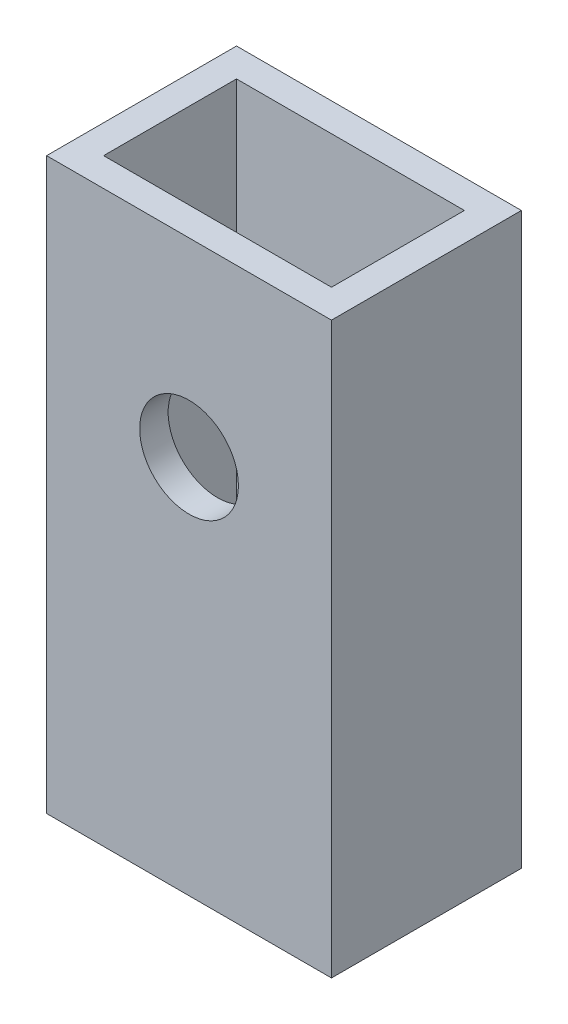
ISO-10303-21;
HEADER;
FILE_DESCRIPTION(('STEP AP214'),'2;1');
FILE_NAME('part.step','',(''),(''),'','','');
FILE_SCHEMA(('AUTOMOTIVE_DESIGN { 1 0 10303 214 1 1 1 1 }'));
ENDSEC;
DATA;
#1=APPLICATION_CONTEXT('core data for automotive mechanical design processes');
#2=APPLICATION_PROTOCOL_DEFINITION('international standard','automotive_design',2000,#1);
#3=PRODUCT_CONTEXT('',#1,'mechanical');
#4=PRODUCT('Part','Part','',(#3));
#5=PRODUCT_RELATED_PRODUCT_CATEGORY('part','',(#4));
#6=PRODUCT_DEFINITION_FORMATION('','',#4);
#7=PRODUCT_DEFINITION_CONTEXT('part definition',#1,'design');
#8=PRODUCT_DEFINITION('design','',#6,#7);
#9=PRODUCT_DEFINITION_SHAPE('','',#8);
#10=(LENGTH_UNIT() NAMED_UNIT(*) SI_UNIT(.MILLI.,.METRE.));
#11=(NAMED_UNIT(*) PLANE_ANGLE_UNIT() SI_UNIT($,.RADIAN.));
#12=(NAMED_UNIT(*) SI_UNIT($,.STERADIAN.) SOLID_ANGLE_UNIT());
#13=UNCERTAINTY_MEASURE_WITH_UNIT(LENGTH_MEASURE(1.E-05),#10,'distance_accuracy_value','');
#14=(GEOMETRIC_REPRESENTATION_CONTEXT(3) GLOBAL_UNCERTAINTY_ASSIGNED_CONTEXT((#13)) GLOBAL_UNIT_ASSIGNED_CONTEXT((#10,
#11,#12)) REPRESENTATION_CONTEXT('',''));
#15=CARTESIAN_POINT('',(0.,0.,0.));
#16=DIRECTION('',(0.,0.,1.));
#17=DIRECTION('',(1.,0.,0.));
#18=AXIS2_PLACEMENT_3D('',#15,#16,#17);
#19=CARTESIAN_POINT('',(7.5,30.,-5.));
#20=DIRECTION('',(-1.,0.,0.));
#21=DIRECTION('',(0.,0.,1.));
#22=AXIS2_PLACEMENT_3D('',#19,#20,#21);
#23=PLANE('',#22);
#24=DIRECTION('',(0.,0.,-1.));
#25=VECTOR('',#24,1.);
#26=CARTESIAN_POINT('',(7.5,0.,-5.));
#27=LINE('',#26,#25);
#28=CARTESIAN_POINT('',(7.5,0.,5.));
#29=VERTEX_POINT('',#28);
#30=CARTESIAN_POINT('',(7.5,0.,-5.));
#31=VERTEX_POINT('',#30);
#32=EDGE_CURVE('E144',#29,#31,#27,.T.);
#33=ORIENTED_EDGE('',*,*,#32,.T.);
#34=DIRECTION('',(0.,-1.,0.));
#35=VECTOR('',#34,1.);
#36=CARTESIAN_POINT('',(7.5,30.,-5.));
#37=LINE('',#36,#35);
#38=CARTESIAN_POINT('',(7.5,30.,-5.));
#39=VERTEX_POINT('',#38);
#40=EDGE_CURVE('E12',#39,#31,#37,.T.);
#41=ORIENTED_EDGE('',*,*,#40,.F.);
#42=DIRECTION('',(0.,0.,-1.));
#43=VECTOR('',#42,1.);
#44=CARTESIAN_POINT('',(7.5,30.,-5.));
#45=LINE('',#44,#43);
#46=CARTESIAN_POINT('',(7.5,30.,5.));
#47=VERTEX_POINT('',#46);
#48=EDGE_CURVE('E146',#47,#39,#45,.T.);
#49=ORIENTED_EDGE('',*,*,#48,.F.);
#50=DIRECTION('',(0.,-1.,0.));
#51=VECTOR('',#50,1.);
#52=CARTESIAN_POINT('',(7.5,30.,5.));
#53=LINE('',#52,#51);
#54=EDGE_CURVE('E152',#47,#29,#53,.T.);
#55=ORIENTED_EDGE('',*,*,#54,.T.);
#56=EDGE_LOOP('',(#33,#41,#49,#55));
#57=FACE_BOUND('',#56,.T.);
#58=ADVANCED_FACE('F37',(#57),#23,.F.);
#59=CARTESIAN_POINT('',(-7.5,30.,-5.));
#60=DIRECTION('',(0.,0.,1.));
#61=DIRECTION('',(1.,0.,0.));
#62=AXIS2_PLACEMENT_3D('',#59,#60,#61);
#63=PLANE('',#62);
#64=CARTESIAN_POINT('',(0.,6.25,-5.));
#65=DIRECTION('',(0.,0.,-1.));
#66=DIRECTION('',(-1.,0.,0.));
#67=AXIS2_PLACEMENT_3D('',#64,#65,#66);
#68=CIRCLE('',#67,1.6);
#69=CARTESIAN_POINT('',(-1.6,6.25,-5.));
#70=VERTEX_POINT('',#69);
#71=EDGE_CURVE('E198',#70,#70,#68,.T.);
#72=ORIENTED_EDGE('',*,*,#71,.F.);
#73=EDGE_LOOP('',(#72));
#74=FACE_BOUND('',#73,.T.);
#75=CARTESIAN_POINT('',(0.,20.,-5.));
#76=DIRECTION('',(0.,0.,1.));
#77=DIRECTION('',(1.,0.,0.));
#78=AXIS2_PLACEMENT_3D('',#75,#76,#77);
#79=CIRCLE('',#78,2.6);
#80=CARTESIAN_POINT('',(2.6,20.,-5.));
#81=VERTEX_POINT('',#80);
#82=EDGE_CURVE('E201',#81,#81,#79,.T.);
#83=ORIENTED_EDGE('',*,*,#82,.T.);
#84=EDGE_LOOP('',(#83));
#85=FACE_BOUND('',#84,.T.);
#86=DIRECTION('',(-1.,0.,0.));
#87=VECTOR('',#86,1.);
#88=CARTESIAN_POINT('',(-7.5,0.,-5.));
#89=LINE('',#88,#87);
#90=CARTESIAN_POINT('',(-7.5,0.,-5.));
#91=VERTEX_POINT('',#90);
#92=EDGE_CURVE('E155',#31,#91,#89,.T.);
#93=ORIENTED_EDGE('',*,*,#92,.T.);
#94=DIRECTION('',(0.,-1.,0.));
#95=VECTOR('',#94,1.);
#96=CARTESIAN_POINT('',(-7.5,30.,-5.));
#97=LINE('',#96,#95);
#98=CARTESIAN_POINT('',(-7.5,30.,-5.));
#99=VERTEX_POINT('',#98);
#100=EDGE_CURVE('E45',#99,#91,#97,.T.);
#101=ORIENTED_EDGE('',*,*,#100,.F.);
#102=DIRECTION('',(-1.,0.,0.));
#103=VECTOR('',#102,1.);
#104=CARTESIAN_POINT('',(-7.5,30.,-5.));
#105=LINE('',#104,#103);
#106=EDGE_CURVE('E89',#39,#99,#105,.T.);
#107=ORIENTED_EDGE('',*,*,#106,.F.);
#108=ORIENTED_EDGE('',*,*,#40,.T.);
#109=EDGE_LOOP('',(#93,#101,#107,#108));
#110=FACE_BOUND('',#109,.T.);
#111=ADVANCED_FACE('F184',(#74,#85,#110),#63,.F.);
#112=CARTESIAN_POINT('',(-7.5,30.,-5.));
#113=DIRECTION('',(1.,0.,0.));
#114=DIRECTION('',(0.,0.,-1.));
#115=AXIS2_PLACEMENT_3D('',#112,#113,#114);
#116=PLANE('',#115);
#117=DIRECTION('',(0.,0.,1.));
#118=VECTOR('',#117,1.);
#119=CARTESIAN_POINT('',(-7.5,0.,-5.));
#120=LINE('',#119,#118);
#121=CARTESIAN_POINT('',(-7.5,0.,5.));
#122=VERTEX_POINT('',#121);
#123=EDGE_CURVE('E157',#91,#122,#120,.T.);
#124=ORIENTED_EDGE('',*,*,#123,.T.);
#125=DIRECTION('',(0.,-1.,0.));
#126=VECTOR('',#125,1.);
#127=CARTESIAN_POINT('',(-7.5,30.,5.));
#128=LINE('',#127,#126);
#129=CARTESIAN_POINT('',(-7.5,30.,5.));
#130=VERTEX_POINT('',#129);
#131=EDGE_CURVE('E161',#130,#122,#128,.T.);
#132=ORIENTED_EDGE('',*,*,#131,.F.);
#133=DIRECTION('',(0.,0.,1.));
#134=VECTOR('',#133,1.);
#135=CARTESIAN_POINT('',(-7.5,30.,-5.));
#136=LINE('',#135,#134);
#137=EDGE_CURVE('E149',#99,#130,#136,.T.);
#138=ORIENTED_EDGE('',*,*,#137,.F.);
#139=ORIENTED_EDGE('',*,*,#100,.T.);
#140=EDGE_LOOP('',(#124,#132,#138,#139));
#141=FACE_BOUND('',#140,.T.);
#142=ADVANCED_FACE('F167',(#141),#116,.F.);
#143=CARTESIAN_POINT('',(-7.5,30.,5.));
#144=DIRECTION('',(0.,0.,-1.));
#145=DIRECTION('',(-1.,0.,0.));
#146=AXIS2_PLACEMENT_3D('',#143,#144,#145);
#147=PLANE('',#146);
#148=CARTESIAN_POINT('',(0.,20.,5.));
#149=DIRECTION('',(0.,0.,1.));
#150=DIRECTION('',(1.,0.,0.));
#151=AXIS2_PLACEMENT_3D('',#148,#149,#150);
#152=CIRCLE('',#151,2.6);
#153=CARTESIAN_POINT('',(2.6,20.,5.));
#154=VERTEX_POINT('',#153);
#155=EDGE_CURVE('E203',#154,#154,#152,.T.);
#156=ORIENTED_EDGE('',*,*,#155,.F.);
#157=EDGE_LOOP('',(#156));
#158=FACE_BOUND('',#157,.T.);
#159=DIRECTION('',(1.,0.,0.));
#160=VECTOR('',#159,1.);
#161=CARTESIAN_POINT('',(-7.5,0.,5.));
#162=LINE('',#161,#160);
#163=EDGE_CURVE('E82',#122,#29,#162,.T.);
#164=ORIENTED_EDGE('',*,*,#163,.T.);
#165=ORIENTED_EDGE('',*,*,#54,.F.);
#166=DIRECTION('',(1.,0.,0.));
#167=VECTOR('',#166,1.);
#168=CARTESIAN_POINT('',(-7.5,30.,5.));
#169=LINE('',#168,#167);
#170=EDGE_CURVE('E61',#130,#47,#169,.T.);
#171=ORIENTED_EDGE('',*,*,#170,.F.);
#172=ORIENTED_EDGE('',*,*,#131,.T.);
#173=EDGE_LOOP('',(#164,#165,#171,#172));
#174=FACE_BOUND('',#173,.T.);
#175=ADVANCED_FACE('F175',(#158,#174),#147,.F.);
#176=CARTESIAN_POINT('',(0.,30.,0.));
#177=DIRECTION('',(0.,1.,0.));
#178=DIRECTION('',(0.,0.,1.));
#179=AXIS2_PLACEMENT_3D('',#176,#177,#178);
#180=PLANE('',#179);
#181=DIRECTION('',(0.,0.,-1.));
#182=VECTOR('',#181,1.);
#183=CARTESIAN_POINT('',(6.,30.,-3.5));
#184=LINE('',#183,#182);
#185=CARTESIAN_POINT('',(6.,30.,3.5));
#186=VERTEX_POINT('',#185);
#187=CARTESIAN_POINT('',(6.,30.,-3.5));
#188=VERTEX_POINT('',#187);
#189=EDGE_CURVE('E52',#186,#188,#184,.T.);
#190=ORIENTED_EDGE('',*,*,#189,.F.);
#191=DIRECTION('',(1.,0.,0.));
#192=VECTOR('',#191,1.);
#193=CARTESIAN_POINT('',(-6.,30.,3.50000000000001));
#194=LINE('',#193,#192);
#195=CARTESIAN_POINT('',(-6.,30.,3.50000000000001));
#196=VERTEX_POINT('',#195);
#197=EDGE_CURVE('E133',#196,#186,#194,.T.);
#198=ORIENTED_EDGE('',*,*,#197,.F.);
#199=DIRECTION('',(0.,0.,1.));
#200=VECTOR('',#199,1.);
#201=CARTESIAN_POINT('',(-6.,30.,-3.5));
#202=LINE('',#201,#200);
#203=CARTESIAN_POINT('',(-6.,30.,-3.5));
#204=VERTEX_POINT('',#203);
#205=EDGE_CURVE('E117',#204,#196,#202,.T.);
#206=ORIENTED_EDGE('',*,*,#205,.F.);
#207=DIRECTION('',(-1.,0.,0.));
#208=VECTOR('',#207,1.);
#209=CARTESIAN_POINT('',(-6.,30.,-3.5));
#210=LINE('',#209,#208);
#211=EDGE_CURVE('E127',#188,#204,#210,.T.);
#212=ORIENTED_EDGE('',*,*,#211,.F.);
#213=EDGE_LOOP('',(#190,#198,#206,#212));
#214=FACE_BOUND('',#213,.T.);
#215=ORIENTED_EDGE('',*,*,#48,.T.);
#216=ORIENTED_EDGE('',*,*,#106,.T.);
#217=ORIENTED_EDGE('',*,*,#137,.T.);
#218=ORIENTED_EDGE('',*,*,#170,.T.);
#219=EDGE_LOOP('',(#215,#216,#217,#218));
#220=FACE_BOUND('',#219,.T.);
#221=ADVANCED_FACE('F131',(#214,#220),#180,.T.);
#222=CARTESIAN_POINT('',(0.,0.,0.));
#223=DIRECTION('',(0.,1.,0.));
#224=DIRECTION('',(0.,0.,1.));
#225=AXIS2_PLACEMENT_3D('',#222,#223,#224);
#226=PLANE('',#225);
#227=ORIENTED_EDGE('',*,*,#32,.F.);
#228=ORIENTED_EDGE('',*,*,#163,.F.);
#229=ORIENTED_EDGE('',*,*,#123,.F.);
#230=ORIENTED_EDGE('',*,*,#92,.F.);
#231=EDGE_LOOP('',(#227,#228,#229,#230));
#232=FACE_BOUND('',#231,.T.);
#233=ADVANCED_FACE('F171',(#232),#226,.F.);
#234=CARTESIAN_POINT('',(6.,-13.8924439894498,-3.5));
#235=DIRECTION('',(1.,0.,0.));
#236=DIRECTION('',(0.,0.,-1.));
#237=AXIS2_PLACEMENT_3D('',#234,#235,#236);
#238=PLANE('',#237);
#239=DIRECTION('',(0.,0.,1.));
#240=VECTOR('',#239,1.);
#241=CARTESIAN_POINT('',(6.,1.5,-3.5));
#242=LINE('',#241,#240);
#243=CARTESIAN_POINT('',(6.,1.5,-3.5));
#244=VERTEX_POINT('',#243);
#245=CARTESIAN_POINT('',(6.,1.5,3.5));
#246=VERTEX_POINT('',#245);
#247=EDGE_CURVE('E145',#244,#246,#242,.T.);
#248=ORIENTED_EDGE('',*,*,#247,.T.);
#249=DIRECTION('',(0.,1.,0.));
#250=VECTOR('',#249,1.);
#251=CARTESIAN_POINT('',(6.,-13.8924439894498,3.5));
#252=LINE('',#251,#250);
#253=EDGE_CURVE('E138',#246,#186,#252,.T.);
#254=ORIENTED_EDGE('',*,*,#253,.T.);
#255=ORIENTED_EDGE('',*,*,#189,.T.);
#256=DIRECTION('',(0.,1.,0.));
#257=VECTOR('',#256,1.);
#258=CARTESIAN_POINT('',(6.,-13.8924439894498,-3.5));
#259=LINE('',#258,#257);
#260=EDGE_CURVE('E124',#244,#188,#259,.T.);
#261=ORIENTED_EDGE('',*,*,#260,.F.);
#262=EDGE_LOOP('',(#248,#254,#255,#261));
#263=FACE_BOUND('',#262,.T.);
#264=ADVANCED_FACE('F220',(#263),#238,.F.);
#265=CARTESIAN_POINT('',(-6.,-13.8924439894498,3.50000000000001));
#266=DIRECTION('',(0.,0.,1.));
#267=DIRECTION('',(1.,0.,0.));
#268=AXIS2_PLACEMENT_3D('',#265,#266,#267);
#269=PLANE('',#268);
#270=CARTESIAN_POINT('',(0.,20.,3.5));
#271=DIRECTION('',(0.,0.,1.));
#272=DIRECTION('',(1.,0.,0.));
#273=AXIS2_PLACEMENT_3D('',#270,#271,#272);
#274=CIRCLE('',#273,2.6);
#275=CARTESIAN_POINT('',(2.6,20.,3.5));
#276=VERTEX_POINT('',#275);
#277=EDGE_CURVE('E206',#276,#276,#274,.T.);
#278=ORIENTED_EDGE('',*,*,#277,.T.);
#279=EDGE_LOOP('',(#278));
#280=FACE_BOUND('',#279,.T.);
#281=DIRECTION('',(-1.,0.,0.));
#282=VECTOR('',#281,1.);
#283=CARTESIAN_POINT('',(-6.,1.5,3.50000000000001));
#284=LINE('',#283,#282);
#285=CARTESIAN_POINT('',(-6.,1.5,3.50000000000001));
#286=VERTEX_POINT('',#285);
#287=EDGE_CURVE('E216',#246,#286,#284,.T.);
#288=ORIENTED_EDGE('',*,*,#287,.T.);
#289=DIRECTION('',(0.,1.,0.));
#290=VECTOR('',#289,1.);
#291=CARTESIAN_POINT('',(-6.,-13.8924439894498,3.50000000000001));
#292=LINE('',#291,#290);
#293=EDGE_CURVE('E123',#286,#196,#292,.T.);
#294=ORIENTED_EDGE('',*,*,#293,.T.);
#295=ORIENTED_EDGE('',*,*,#197,.T.);
#296=ORIENTED_EDGE('',*,*,#253,.F.);
#297=EDGE_LOOP('',(#288,#294,#295,#296));
#298=FACE_BOUND('',#297,.T.);
#299=ADVANCED_FACE('F225',(#280,#298),#269,.F.);
#300=CARTESIAN_POINT('',(-6.,-13.8924439894498,-3.5));
#301=DIRECTION('',(-1.,0.,0.));
#302=DIRECTION('',(0.,0.,1.));
#303=AXIS2_PLACEMENT_3D('',#300,#301,#302);
#304=PLANE('',#303);
#305=DIRECTION('',(0.,0.,-1.));
#306=VECTOR('',#305,1.);
#307=CARTESIAN_POINT('',(-6.,1.5,-3.5));
#308=LINE('',#307,#306);
#309=CARTESIAN_POINT('',(-6.,1.5,-3.5));
#310=VERTEX_POINT('',#309);
#311=EDGE_CURVE('E120',#286,#310,#308,.T.);
#312=ORIENTED_EDGE('',*,*,#311,.T.);
#313=DIRECTION('',(0.,1.,0.));
#314=VECTOR('',#313,1.);
#315=CARTESIAN_POINT('',(-6.,-13.8924439894498,-3.5));
#316=LINE('',#315,#314);
#317=EDGE_CURVE('E112',#310,#204,#316,.T.);
#318=ORIENTED_EDGE('',*,*,#317,.T.);
#319=ORIENTED_EDGE('',*,*,#205,.T.);
#320=ORIENTED_EDGE('',*,*,#293,.F.);
#321=EDGE_LOOP('',(#312,#318,#319,#320));
#322=FACE_BOUND('',#321,.T.);
#323=ADVANCED_FACE('F114',(#322),#304,.F.);
#324=CARTESIAN_POINT('',(-6.,-13.8924439894498,-3.5));
#325=DIRECTION('',(0.,0.,-1.));
#326=DIRECTION('',(-1.,0.,0.));
#327=AXIS2_PLACEMENT_3D('',#324,#325,#326);
#328=PLANE('',#327);
#329=CARTESIAN_POINT('',(0.,6.25,-3.5));
#330=DIRECTION('',(0.,0.,-1.));
#331=DIRECTION('',(-1.,0.,0.));
#332=AXIS2_PLACEMENT_3D('',#329,#330,#331);
#333=CIRCLE('',#332,1.6);
#334=CARTESIAN_POINT('',(-1.6,6.25,-3.5));
#335=VERTEX_POINT('',#334);
#336=EDGE_CURVE('E208',#335,#335,#333,.T.);
#337=ORIENTED_EDGE('',*,*,#336,.T.);
#338=EDGE_LOOP('',(#337));
#339=FACE_BOUND('',#338,.T.);
#340=CARTESIAN_POINT('',(0.,20.,-3.5));
#341=DIRECTION('',(0.,0.,-1.));
#342=DIRECTION('',(-1.,0.,0.));
#343=AXIS2_PLACEMENT_3D('',#340,#341,#342);
#344=CIRCLE('',#343,2.6);
#345=CARTESIAN_POINT('',(-2.6,20.,-3.5));
#346=VERTEX_POINT('',#345);
#347=EDGE_CURVE('E40',#346,#346,#344,.T.);
#348=ORIENTED_EDGE('',*,*,#347,.T.);
#349=EDGE_LOOP('',(#348));
#350=FACE_BOUND('',#349,.T.);
#351=DIRECTION('',(1.,0.,0.));
#352=VECTOR('',#351,1.);
#353=CARTESIAN_POINT('',(-6.,1.5,-3.5));
#354=LINE('',#353,#352);
#355=EDGE_CURVE('E142',#310,#244,#354,.T.);
#356=ORIENTED_EDGE('',*,*,#355,.T.);
#357=ORIENTED_EDGE('',*,*,#260,.T.);
#358=ORIENTED_EDGE('',*,*,#211,.T.);
#359=ORIENTED_EDGE('',*,*,#317,.F.);
#360=EDGE_LOOP('',(#356,#357,#358,#359));
#361=FACE_BOUND('',#360,.T.);
#362=ADVANCED_FACE('F128',(#339,#350,#361),#328,.F.);
#363=CARTESIAN_POINT('',(0.,1.5,0.));
#364=DIRECTION('',(0.,1.,0.));
#365=DIRECTION('',(0.,0.,1.));
#366=AXIS2_PLACEMENT_3D('',#363,#364,#365);
#367=PLANE('',#366);
#368=ORIENTED_EDGE('',*,*,#247,.F.);
#369=ORIENTED_EDGE('',*,*,#355,.F.);
#370=ORIENTED_EDGE('',*,*,#311,.F.);
#371=ORIENTED_EDGE('',*,*,#287,.F.);
#372=EDGE_LOOP('',(#368,#369,#370,#371));
#373=FACE_BOUND('',#372,.T.);
#374=ADVANCED_FACE('F223',(#373),#367,.T.);
#375=CARTESIAN_POINT('',(0.,20.,-5.));
#376=DIRECTION('',(0.,0.,1.));
#377=DIRECTION('',(1.,0.,0.));
#378=AXIS2_PLACEMENT_3D('',#375,#376,#377);
#379=CYLINDRICAL_SURFACE('',#378,2.6);
#380=ORIENTED_EDGE('',*,*,#82,.F.);
#381=EDGE_LOOP('',(#380));
#382=FACE_BOUND('',#381,.T.);
#383=ORIENTED_EDGE('',*,*,#347,.F.);
#384=EDGE_LOOP('',(#383));
#385=FACE_BOUND('',#384,.T.);
#386=ADVANCED_FACE('F268',(#382,#385),#379,.F.);
#387=ORIENTED_EDGE('',*,*,#155,.T.);
#388=EDGE_LOOP('',(#387));
#389=FACE_BOUND('',#388,.T.);
#390=ORIENTED_EDGE('',*,*,#277,.F.);
#391=EDGE_LOOP('',(#390));
#392=FACE_BOUND('',#391,.T.);
#393=ADVANCED_FACE('F285',(#389,#392),#379,.F.);
#394=CARTESIAN_POINT('',(0.,6.25,-3.5));
#395=DIRECTION('',(0.,0.,-1.));
#396=DIRECTION('',(-1.,0.,0.));
#397=AXIS2_PLACEMENT_3D('',#394,#395,#396);
#398=CYLINDRICAL_SURFACE('',#397,1.6);
#399=ORIENTED_EDGE('',*,*,#336,.F.);
#400=EDGE_LOOP('',(#399));
#401=FACE_BOUND('',#400,.T.);
#402=ORIENTED_EDGE('',*,*,#71,.T.);
#403=EDGE_LOOP('',(#402));
#404=FACE_BOUND('',#403,.T.);
#405=ADVANCED_FACE('F292',(#401,#404),#398,.F.);
#406=CLOSED_SHELL('',(#58,#111,#142,#175,#221,#233,#264,#299,#323,#362,#374,#386,#393,#405));
#407=MANIFOLD_SOLID_BREP('B2',#406);
#408=ADVANCED_BREP_SHAPE_REPRESENTATION('',(#18,#407),#14);
#409=SHAPE_DEFINITION_REPRESENTATION(#9,#408);
ENDSEC;
END-ISO-10303-21;
